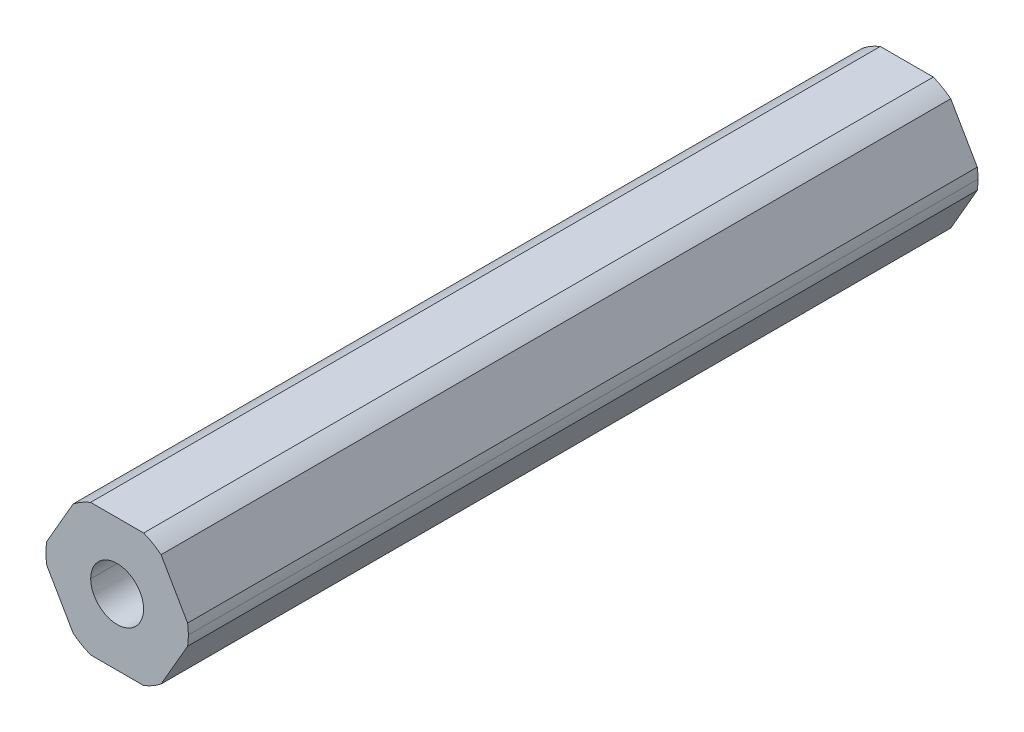
ISO-10303-21;
HEADER;
FILE_DESCRIPTION(('STEP AP214'),'2;1');
FILE_NAME('part.step','',(''),(''),'','','');
FILE_SCHEMA(('AUTOMOTIVE_DESIGN { 1 0 10303 214 1 1 1 1 }'));
ENDSEC;
DATA;
#1=APPLICATION_CONTEXT('core data for automotive mechanical design processes');
#2=APPLICATION_PROTOCOL_DEFINITION('international standard','automotive_design',2000,#1);
#3=PRODUCT_CONTEXT('',#1,'mechanical');
#4=PRODUCT('Part','Part','',(#3));
#5=PRODUCT_RELATED_PRODUCT_CATEGORY('part','',(#4));
#6=PRODUCT_DEFINITION_FORMATION('','',#4);
#7=PRODUCT_DEFINITION_CONTEXT('part definition',#1,'design');
#8=PRODUCT_DEFINITION('design','',#6,#7);
#9=PRODUCT_DEFINITION_SHAPE('','',#8);
#10=(LENGTH_UNIT() NAMED_UNIT(*) SI_UNIT(.MILLI.,.METRE.));
#11=(NAMED_UNIT(*) PLANE_ANGLE_UNIT() SI_UNIT($,.RADIAN.));
#12=(NAMED_UNIT(*) SI_UNIT($,.STERADIAN.) SOLID_ANGLE_UNIT());
#13=UNCERTAINTY_MEASURE_WITH_UNIT(LENGTH_MEASURE(1.E-05),#10,'distance_accuracy_value','');
#14=(GEOMETRIC_REPRESENTATION_CONTEXT(3) GLOBAL_UNCERTAINTY_ASSIGNED_CONTEXT((#13)) GLOBAL_UNIT_ASSIGNED_CONTEXT((#10,
#11,#12)) REPRESENTATION_CONTEXT('',''));
#15=CARTESIAN_POINT('',(0.,0.,0.));
#16=DIRECTION('',(0.,0.,1.));
#17=DIRECTION('',(1.,0.,0.));
#18=AXIS2_PLACEMENT_3D('',#15,#16,#17);
#19=CARTESIAN_POINT('',(0.,0.,-228.6));
#20=DIRECTION('',(0.,0.,1.));
#21=DIRECTION('',(1.,0.,0.));
#22=AXIS2_PLACEMENT_3D('',#19,#20,#21);
#23=CYLINDRICAL_SURFACE('',#22,2.55);
#24=CARTESIAN_POINT('',(0.,0.,152.4));
#25=DIRECTION('',(0.,0.,-1.));
#26=DIRECTION('',(-1.,0.,0.));
#27=AXIS2_PLACEMENT_3D('',#24,#25,#26);
#28=CIRCLE('',#27,2.55);
#29=CARTESIAN_POINT('',(2.55,0.,152.4));
#30=VERTEX_POINT('',#29);
#31=CARTESIAN_POINT('',(-2.55,0.,152.4));
#32=VERTEX_POINT('',#31);
#33=EDGE_CURVE('E59',#30,#32,#28,.F.);
#34=ORIENTED_EDGE('',*,*,#33,.F.);
#35=DIRECTION('',(0.,0.,1.));
#36=VECTOR('',#35,1.);
#37=CARTESIAN_POINT('',(2.55,0.,-228.6));
#38=LINE('',#37,#36);
#39=CARTESIAN_POINT('',(2.55,0.,228.6));
#40=VERTEX_POINT('',#39);
#41=EDGE_CURVE('E162',#30,#40,#38,.T.);
#42=ORIENTED_EDGE('',*,*,#41,.T.);
#43=CARTESIAN_POINT('',(0.,0.,228.6));
#44=DIRECTION('',(0.,0.,1.));
#45=DIRECTION('',(1.,0.,0.));
#46=AXIS2_PLACEMENT_3D('',#43,#44,#45);
#47=CIRCLE('',#46,2.55);
#48=CARTESIAN_POINT('',(-2.55,0.,228.6));
#49=VERTEX_POINT('',#48);
#50=EDGE_CURVE('E46',#40,#49,#47,.T.);
#51=ORIENTED_EDGE('',*,*,#50,.T.);
#52=DIRECTION('',(0.,0.,1.));
#53=VECTOR('',#52,1.);
#54=CARTESIAN_POINT('',(-2.55,0.,-228.6));
#55=LINE('',#54,#53);
#56=EDGE_CURVE('E164',#32,#49,#55,.T.);
#57=ORIENTED_EDGE('',*,*,#56,.F.);
#58=EDGE_LOOP('',(#34,#42,#51,#57));
#59=FACE_BOUND('',#58,.T.);
#60=ADVANCED_FACE('F38',(#59),#23,.F.);
#61=CARTESIAN_POINT('',(0.,0.,-228.6));
#62=DIRECTION('',(0.,0.,1.));
#63=DIRECTION('',(1.,0.,0.));
#64=AXIS2_PLACEMENT_3D('',#61,#62,#63);
#65=CYLINDRICAL_SURFACE('',#64,6.87);
#66=DIRECTION('',(0.,0.,-1.));
#67=VECTOR('',#66,1.);
#68=CARTESIAN_POINT('',(4.24149521323254,5.40431479062105,-228.6));
#69=LINE('',#68,#67);
#70=CARTESIAN_POINT('',(4.24149521323254,5.40431479062105,228.6));
#71=VERTEX_POINT('',#70);
#72=CARTESIAN_POINT('',(4.24149521323254,5.40431479062105,152.4));
#73=VERTEX_POINT('',#72);
#74=EDGE_CURVE('E252',#71,#73,#69,.T.);
#75=ORIENTED_EDGE('',*,*,#74,.T.);
#76=CARTESIAN_POINT('',(0.,0.,152.4));
#77=DIRECTION('',(0.,0.,-1.));
#78=DIRECTION('',(-1.,0.,0.));
#79=AXIS2_PLACEMENT_3D('',#76,#77,#78);
#80=CIRCLE('',#79,6.87);
#81=CARTESIAN_POINT('',(2.55952629210953,6.3754,152.4));
#82=VERTEX_POINT('',#81);
#83=EDGE_CURVE('E264',#73,#82,#80,.F.);
#84=ORIENTED_EDGE('',*,*,#83,.T.);
#85=DIRECTION('',(0.,0.,1.));
#86=VECTOR('',#85,1.);
#87=CARTESIAN_POINT('',(2.55952629210952,6.3754,-228.6));
#88=LINE('',#87,#86);
#89=CARTESIAN_POINT('',(2.55952629210952,6.3754,228.6));
#90=VERTEX_POINT('',#89);
#91=EDGE_CURVE('E198',#82,#90,#88,.T.);
#92=ORIENTED_EDGE('',*,*,#91,.T.);
#93=CARTESIAN_POINT('',(0.,0.,228.6));
#94=DIRECTION('',(0.,0.,1.));
#95=DIRECTION('',(1.,0.,0.));
#96=AXIS2_PLACEMENT_3D('',#93,#94,#95);
#97=CIRCLE('',#96,6.87);
#98=EDGE_CURVE('E219',#71,#90,#97,.T.);
#99=ORIENTED_EDGE('',*,*,#98,.F.);
#100=EDGE_LOOP('',(#75,#84,#92,#99));
#101=FACE_BOUND('',#100,.T.);
#102=ADVANCED_FACE('F263',(#101),#65,.T.);
#103=CARTESIAN_POINT('',(0.,0.,-228.6));
#104=DIRECTION('',(0.,0.,1.));
#105=DIRECTION('',(1.,0.,0.));
#106=AXIS2_PLACEMENT_3D('',#103,#104,#105);
#107=CYLINDRICAL_SURFACE('',#106,6.87);
#108=DIRECTION('',(0.,0.,-1.));
#109=VECTOR('',#108,1.);
#110=CARTESIAN_POINT('',(-2.55952629210953,6.3754,-228.6));
#111=LINE('',#110,#109);
#112=CARTESIAN_POINT('',(-2.55952629210953,6.3754,228.6));
#113=VERTEX_POINT('',#112);
#114=CARTESIAN_POINT('',(-2.55952629210953,6.3754,152.4));
#115=VERTEX_POINT('',#114);
#116=EDGE_CURVE('E193',#113,#115,#111,.T.);
#117=ORIENTED_EDGE('',*,*,#116,.T.);
#118=CARTESIAN_POINT('',(0.,0.,152.4));
#119=DIRECTION('',(0.,0.,-1.));
#120=DIRECTION('',(-1.,0.,0.));
#121=AXIS2_PLACEMENT_3D('',#118,#119,#120);
#122=CIRCLE('',#121,6.87);
#123=CARTESIAN_POINT('',(-4.24149521323255,5.40431479062105,152.4));
#124=VERTEX_POINT('',#123);
#125=EDGE_CURVE('E278',#115,#124,#122,.F.);
#126=ORIENTED_EDGE('',*,*,#125,.T.);
#127=DIRECTION('',(0.,0.,1.));
#128=VECTOR('',#127,1.);
#129=CARTESIAN_POINT('',(-4.24149521323255,5.40431479062105,-228.6));
#130=LINE('',#129,#128);
#131=CARTESIAN_POINT('',(-4.24149521323255,5.40431479062105,228.6));
#132=VERTEX_POINT('',#131);
#133=EDGE_CURVE('E233',#124,#132,#130,.T.);
#134=ORIENTED_EDGE('',*,*,#133,.T.);
#135=CARTESIAN_POINT('',(0.,0.,228.6));
#136=DIRECTION('',(0.,0.,1.));
#137=DIRECTION('',(1.,0.,0.));
#138=AXIS2_PLACEMENT_3D('',#135,#136,#137);
#139=CIRCLE('',#138,6.87);
#140=EDGE_CURVE('E202',#113,#132,#139,.T.);
#141=ORIENTED_EDGE('',*,*,#140,.F.);
#142=EDGE_LOOP('',(#117,#126,#134,#141));
#143=FACE_BOUND('',#142,.T.);
#144=ADVANCED_FACE('F277',(#143),#107,.T.);
#145=CARTESIAN_POINT('',(0.,0.,-228.6));
#146=DIRECTION('',(0.,0.,1.));
#147=DIRECTION('',(1.,0.,0.));
#148=AXIS2_PLACEMENT_3D('',#145,#146,#147);
#149=CYLINDRICAL_SURFACE('',#148,6.87);
#150=DIRECTION('',(0.,0.,-1.));
#151=VECTOR('',#150,1.);
#152=CARTESIAN_POINT('',(-6.80102150534208,0.97108520937896,-228.6));
#153=LINE('',#152,#151);
#154=CARTESIAN_POINT('',(-6.80102150534208,0.97108520937896,228.6));
#155=VERTEX_POINT('',#154);
#156=CARTESIAN_POINT('',(-6.80102150534208,0.97108520937896,152.4));
#157=VERTEX_POINT('',#156);
#158=EDGE_CURVE('E228',#155,#157,#153,.T.);
#159=ORIENTED_EDGE('',*,*,#158,.T.);
#160=CARTESIAN_POINT('',(0.,0.,152.4));
#161=DIRECTION('',(0.,0.,-1.));
#162=DIRECTION('',(-1.,0.,0.));
#163=AXIS2_PLACEMENT_3D('',#160,#161,#162);
#164=CIRCLE('',#163,6.87);
#165=CARTESIAN_POINT('',(-6.80102150534207,-0.971085209378956,152.4));
#166=VERTEX_POINT('',#165);
#167=EDGE_CURVE('E288',#157,#166,#164,.F.);
#168=ORIENTED_EDGE('',*,*,#167,.T.);
#169=DIRECTION('',(0.,0.,1.));
#170=VECTOR('',#169,1.);
#171=CARTESIAN_POINT('',(-6.80102150534208,-0.971085209378962,-228.6));
#172=LINE('',#171,#170);
#173=CARTESIAN_POINT('',(-6.80102150534208,-0.971085209378956,228.6));
#174=VERTEX_POINT('',#173);
#175=EDGE_CURVE('E186',#166,#174,#172,.T.);
#176=ORIENTED_EDGE('',*,*,#175,.T.);
#177=CARTESIAN_POINT('',(0.,0.,228.6));
#178=DIRECTION('',(0.,0.,1.));
#179=DIRECTION('',(1.,0.,0.));
#180=AXIS2_PLACEMENT_3D('',#177,#178,#179);
#181=CIRCLE('',#180,6.87);
#182=EDGE_CURVE('E191',#155,#174,#181,.T.);
#183=ORIENTED_EDGE('',*,*,#182,.F.);
#184=EDGE_LOOP('',(#159,#168,#176,#183));
#185=FACE_BOUND('',#184,.T.);
#186=ADVANCED_FACE('F287',(#185),#149,.T.);
#187=CARTESIAN_POINT('',(0.,0.,-228.6));
#188=DIRECTION('',(0.,0.,1.));
#189=DIRECTION('',(1.,0.,0.));
#190=AXIS2_PLACEMENT_3D('',#187,#188,#189);
#191=CYLINDRICAL_SURFACE('',#190,6.87);
#192=DIRECTION('',(0.,0.,-1.));
#193=VECTOR('',#192,1.);
#194=CARTESIAN_POINT('',(-4.24149521323255,-5.40431479062104,-228.6));
#195=LINE('',#194,#193);
#196=CARTESIAN_POINT('',(-4.24149521323254,-5.40431479062105,228.6));
#197=VERTEX_POINT('',#196);
#198=CARTESIAN_POINT('',(-4.24149521323254,-5.40431479062105,152.4));
#199=VERTEX_POINT('',#198);
#200=EDGE_CURVE('E181',#197,#199,#195,.T.);
#201=ORIENTED_EDGE('',*,*,#200,.T.);
#202=CARTESIAN_POINT('',(0.,0.,152.4));
#203=DIRECTION('',(0.,0.,-1.));
#204=DIRECTION('',(-1.,0.,0.));
#205=AXIS2_PLACEMENT_3D('',#202,#203,#204);
#206=CIRCLE('',#205,6.87);
#207=CARTESIAN_POINT('',(-2.55952629210953,-6.3754,152.4));
#208=VERTEX_POINT('',#207);
#209=EDGE_CURVE('E298',#199,#208,#206,.F.);
#210=ORIENTED_EDGE('',*,*,#209,.T.);
#211=DIRECTION('',(0.,0.,1.));
#212=VECTOR('',#211,1.);
#213=CARTESIAN_POINT('',(-2.55952629210953,-6.3754,-228.6));
#214=LINE('',#213,#212);
#215=CARTESIAN_POINT('',(-2.55952629210953,-6.3754,228.6));
#216=VERTEX_POINT('',#215);
#217=EDGE_CURVE('E208',#208,#216,#214,.T.);
#218=ORIENTED_EDGE('',*,*,#217,.T.);
#219=CARTESIAN_POINT('',(0.,0.,228.6));
#220=DIRECTION('',(0.,0.,1.));
#221=DIRECTION('',(1.,0.,0.));
#222=AXIS2_PLACEMENT_3D('',#219,#220,#221);
#223=CIRCLE('',#222,6.87);
#224=EDGE_CURVE('E187',#197,#216,#223,.T.);
#225=ORIENTED_EDGE('',*,*,#224,.F.);
#226=EDGE_LOOP('',(#201,#210,#218,#225));
#227=FACE_BOUND('',#226,.T.);
#228=ADVANCED_FACE('F40',(#227),#191,.T.);
#229=CARTESIAN_POINT('',(0.,0.,-228.6));
#230=DIRECTION('',(0.,0.,1.));
#231=DIRECTION('',(1.,0.,0.));
#232=AXIS2_PLACEMENT_3D('',#229,#230,#231);
#233=CYLINDRICAL_SURFACE('',#232,6.87);
#234=DIRECTION('',(0.,0.,-1.));
#235=VECTOR('',#234,1.);
#236=CARTESIAN_POINT('',(2.55952629210953,-6.3754,-228.6));
#237=LINE('',#236,#235);
#238=CARTESIAN_POINT('',(2.55952629210953,-6.3754,228.6));
#239=VERTEX_POINT('',#238);
#240=CARTESIAN_POINT('',(2.55952629210953,-6.3754,152.4));
#241=VERTEX_POINT('',#240);
#242=EDGE_CURVE('E203',#239,#241,#237,.T.);
#243=ORIENTED_EDGE('',*,*,#242,.T.);
#244=CARTESIAN_POINT('',(0.,0.,152.4));
#245=DIRECTION('',(0.,0.,-1.));
#246=DIRECTION('',(-1.,0.,0.));
#247=AXIS2_PLACEMENT_3D('',#244,#245,#246);
#248=CIRCLE('',#247,6.87);
#249=CARTESIAN_POINT('',(4.24149521323254,-5.40431479062105,152.4));
#250=VERTEX_POINT('',#249);
#251=EDGE_CURVE('E309',#241,#250,#248,.F.);
#252=ORIENTED_EDGE('',*,*,#251,.T.);
#253=DIRECTION('',(0.,0.,1.));
#254=VECTOR('',#253,1.);
#255=CARTESIAN_POINT('',(4.24149521323255,-5.40431479062104,-228.6));
#256=LINE('',#255,#254);
#257=CARTESIAN_POINT('',(4.24149521323254,-5.40431479062105,228.6));
#258=VERTEX_POINT('',#257);
#259=EDGE_CURVE('E222',#250,#258,#256,.T.);
#260=ORIENTED_EDGE('',*,*,#259,.T.);
#261=CARTESIAN_POINT('',(0.,0.,228.6));
#262=DIRECTION('',(0.,0.,1.));
#263=DIRECTION('',(1.,0.,0.));
#264=AXIS2_PLACEMENT_3D('',#261,#262,#263);
#265=CIRCLE('',#264,6.87);
#266=EDGE_CURVE('E190',#239,#258,#265,.T.);
#267=ORIENTED_EDGE('',*,*,#266,.F.);
#268=EDGE_LOOP('',(#243,#252,#260,#267));
#269=FACE_BOUND('',#268,.T.);
#270=ADVANCED_FACE('F308',(#269),#233,.T.);
#271=CARTESIAN_POINT('',(0.,0.,-228.6));
#272=DIRECTION('',(0.,0.,1.));
#273=DIRECTION('',(1.,0.,0.));
#274=AXIS2_PLACEMENT_3D('',#271,#272,#273);
#275=CYLINDRICAL_SURFACE('',#274,6.87);
#276=DIRECTION('',(0.,0.,1.));
#277=VECTOR('',#276,1.);
#278=CARTESIAN_POINT('',(6.87,0.,-228.6));
#279=LINE('',#278,#277);
#280=CARTESIAN_POINT('',(6.87,0.,152.4));
#281=VERTEX_POINT('',#280);
#282=CARTESIAN_POINT('',(6.87,0.,228.6));
#283=VERTEX_POINT('',#282);
#284=EDGE_CURVE('E171',#281,#283,#279,.T.);
#285=ORIENTED_EDGE('',*,*,#284,.F.);
#286=CARTESIAN_POINT('',(0.,0.,152.4));
#287=DIRECTION('',(0.,0.,-1.));
#288=DIRECTION('',(-1.,0.,0.));
#289=AXIS2_PLACEMENT_3D('',#286,#287,#288);
#290=CIRCLE('',#289,6.87);
#291=CARTESIAN_POINT('',(6.80102150534208,0.97108520937895,152.4));
#292=VERTEX_POINT('',#291);
#293=EDGE_CURVE('E53',#281,#292,#290,.F.);
#294=ORIENTED_EDGE('',*,*,#293,.T.);
#295=DIRECTION('',(0.,0.,1.));
#296=VECTOR('',#295,1.);
#297=CARTESIAN_POINT('',(6.80102150534208,0.971085209378949,-228.6));
#298=LINE('',#297,#296);
#299=CARTESIAN_POINT('',(6.80102150534208,0.97108520937895,228.6));
#300=VERTEX_POINT('',#299);
#301=EDGE_CURVE('E236',#292,#300,#298,.T.);
#302=ORIENTED_EDGE('',*,*,#301,.T.);
#303=CARTESIAN_POINT('',(0.,0.,228.6));
#304=DIRECTION('',(0.,0.,1.));
#305=DIRECTION('',(1.,0.,0.));
#306=AXIS2_PLACEMENT_3D('',#303,#304,#305);
#307=CIRCLE('',#306,6.87);
#308=EDGE_CURVE('E209',#283,#300,#307,.T.);
#309=ORIENTED_EDGE('',*,*,#308,.F.);
#310=EDGE_LOOP('',(#285,#294,#302,#309));
#311=FACE_BOUND('',#310,.T.);
#312=ADVANCED_FACE('F349',(#311),#275,.T.);
#313=CARTESIAN_POINT('',(-3.68083890619154,-6.3754,228.6));
#314=DIRECTION('',(0.,1.,0.));
#315=DIRECTION('',(1.,0.,0.));
#316=AXIS2_PLACEMENT_3D('',#313,#314,#315);
#317=PLANE('',#316);
#318=DIRECTION('',(-1.,0.,0.));
#319=VECTOR('',#318,1.);
#320=CARTESIAN_POINT('',(-3.68083890619154,-6.3754,152.4));
#321=LINE('',#320,#319);
#322=EDGE_CURVE('E305',#241,#208,#321,.T.);
#323=ORIENTED_EDGE('',*,*,#322,.F.);
#324=ORIENTED_EDGE('',*,*,#242,.F.);
#325=DIRECTION('',(1.,0.,0.));
#326=VECTOR('',#325,1.);
#327=CARTESIAN_POINT('',(-3.68083890619154,-6.3754,228.6));
#328=LINE('',#327,#326);
#329=EDGE_CURVE('E207',#216,#239,#328,.T.);
#330=ORIENTED_EDGE('',*,*,#329,.F.);
#331=ORIENTED_EDGE('',*,*,#217,.F.);
#332=EDGE_LOOP('',(#323,#324,#330,#331));
#333=FACE_BOUND('',#332,.T.);
#334=ADVANCED_FACE('F304',(#333),#317,.F.);
#335=CARTESIAN_POINT('',(-7.36167781238308,0.,228.6));
#336=DIRECTION('',(0.866025403784439,0.5,0.));
#337=DIRECTION('',(0.,0.,-1.));
#338=AXIS2_PLACEMENT_3D('',#335,#336,#337);
#339=PLANE('',#338);
#340=DIRECTION('',(-0.5,0.866025403784439,0.));
#341=VECTOR('',#340,1.);
#342=CARTESIAN_POINT('',(-7.36167781238308,0.,152.4));
#343=LINE('',#342,#341);
#344=EDGE_CURVE('E295',#199,#166,#343,.T.);
#345=ORIENTED_EDGE('',*,*,#344,.F.);
#346=ORIENTED_EDGE('',*,*,#200,.F.);
#347=DIRECTION('',(0.5,-0.866025403784439,0.));
#348=VECTOR('',#347,1.);
#349=CARTESIAN_POINT('',(-7.36167781238308,0.,228.6));
#350=LINE('',#349,#348);
#351=EDGE_CURVE('E185',#174,#197,#350,.T.);
#352=ORIENTED_EDGE('',*,*,#351,.F.);
#353=ORIENTED_EDGE('',*,*,#175,.F.);
#354=EDGE_LOOP('',(#345,#346,#352,#353));
#355=FACE_BOUND('',#354,.T.);
#356=ADVANCED_FACE('F294',(#355),#339,.F.);
#357=CARTESIAN_POINT('',(-3.68083890619154,6.3754,228.6));
#358=DIRECTION('',(0.866025403784439,-0.5,0.));
#359=DIRECTION('',(0.,0.,-1.));
#360=AXIS2_PLACEMENT_3D('',#357,#358,#359);
#361=PLANE('',#360);
#362=DIRECTION('',(0.5,0.866025403784439,0.));
#363=VECTOR('',#362,1.);
#364=CARTESIAN_POINT('',(-3.68083890619154,6.3754,152.4));
#365=LINE('',#364,#363);
#366=EDGE_CURVE('E214',#157,#124,#365,.T.);
#367=ORIENTED_EDGE('',*,*,#366,.F.);
#368=ORIENTED_EDGE('',*,*,#158,.F.);
#369=DIRECTION('',(-0.5,-0.866025403784439,0.));
#370=VECTOR('',#369,1.);
#371=CARTESIAN_POINT('',(-3.68083890619154,6.3754,228.6));
#372=LINE('',#371,#370);
#373=EDGE_CURVE('E232',#132,#155,#372,.T.);
#374=ORIENTED_EDGE('',*,*,#373,.F.);
#375=ORIENTED_EDGE('',*,*,#133,.F.);
#376=EDGE_LOOP('',(#367,#368,#374,#375));
#377=FACE_BOUND('',#376,.T.);
#378=ADVANCED_FACE('F284',(#377),#361,.F.);
#379=CARTESIAN_POINT('',(3.68083890619154,6.3754,228.6));
#380=DIRECTION('',(0.,-1.,0.));
#381=DIRECTION('',(0.,0.,-1.));
#382=AXIS2_PLACEMENT_3D('',#379,#380,#381);
#383=PLANE('',#382);
#384=DIRECTION('',(1.,0.,0.));
#385=VECTOR('',#384,1.);
#386=CARTESIAN_POINT('',(3.68083890619154,6.3754,152.4));
#387=LINE('',#386,#385);
#388=EDGE_CURVE('E274',#115,#82,#387,.T.);
#389=ORIENTED_EDGE('',*,*,#388,.F.);
#390=ORIENTED_EDGE('',*,*,#116,.F.);
#391=DIRECTION('',(-1.,0.,0.));
#392=VECTOR('',#391,1.);
#393=CARTESIAN_POINT('',(3.68083890619154,6.3754,228.6));
#394=LINE('',#393,#392);
#395=EDGE_CURVE('E197',#90,#113,#394,.T.);
#396=ORIENTED_EDGE('',*,*,#395,.F.);
#397=ORIENTED_EDGE('',*,*,#91,.F.);
#398=EDGE_LOOP('',(#389,#390,#396,#397));
#399=FACE_BOUND('',#398,.T.);
#400=ADVANCED_FACE('F273',(#399),#383,.F.);
#401=CARTESIAN_POINT('',(7.36167781238308,0.,228.6));
#402=DIRECTION('',(-0.866025403784439,-0.5,0.));
#403=DIRECTION('',(-0.5,0.866025403784439,0.));
#404=AXIS2_PLACEMENT_3D('',#401,#402,#403);
#405=PLANE('',#404);
#406=DIRECTION('',(0.5,-0.866025403784439,0.));
#407=VECTOR('',#406,1.);
#408=CARTESIAN_POINT('',(7.36167781238308,0.,152.4));
#409=LINE('',#408,#407);
#410=EDGE_CURVE('E336',#73,#292,#409,.T.);
#411=ORIENTED_EDGE('',*,*,#410,.F.);
#412=ORIENTED_EDGE('',*,*,#74,.F.);
#413=DIRECTION('',(-0.5,0.866025403784439,0.));
#414=VECTOR('',#413,1.);
#415=CARTESIAN_POINT('',(7.36167781238308,0.,228.6));
#416=LINE('',#415,#414);
#417=EDGE_CURVE('E256',#300,#71,#416,.T.);
#418=ORIENTED_EDGE('',*,*,#417,.F.);
#419=ORIENTED_EDGE('',*,*,#301,.F.);
#420=EDGE_LOOP('',(#411,#412,#418,#419));
#421=FACE_BOUND('',#420,.T.);
#422=ADVANCED_FACE('F334',(#421),#405,.F.);
#423=CARTESIAN_POINT('',(3.68083890619154,-6.3754,228.6));
#424=DIRECTION('',(-0.866025403784439,0.5,0.));
#425=DIRECTION('',(0.,0.,1.));
#426=AXIS2_PLACEMENT_3D('',#423,#424,#425);
#427=PLANE('',#426);
#428=DIRECTION('',(-0.5,-0.866025403784439,0.));
#429=VECTOR('',#428,1.);
#430=CARTESIAN_POINT('',(3.68083890619154,-6.3754,152.4));
#431=LINE('',#430,#429);
#432=CARTESIAN_POINT('',(6.80102150534208,-0.971085209378955,152.4));
#433=VERTEX_POINT('',#432);
#434=EDGE_CURVE('E319',#433,#250,#431,.T.);
#435=ORIENTED_EDGE('',*,*,#434,.F.);
#436=DIRECTION('',(0.,0.,-1.));
#437=VECTOR('',#436,1.);
#438=CARTESIAN_POINT('',(6.80102150534208,-0.971085209378962,-228.6));
#439=LINE('',#438,#437);
#440=CARTESIAN_POINT('',(6.80102150534208,-0.971085209378955,228.6));
#441=VERTEX_POINT('',#440);
#442=EDGE_CURVE('E179',#441,#433,#439,.T.);
#443=ORIENTED_EDGE('',*,*,#442,.F.);
#444=DIRECTION('',(0.5,0.866025403784439,0.));
#445=VECTOR('',#444,1.);
#446=CARTESIAN_POINT('',(3.68083890619154,-6.3754,228.6));
#447=LINE('',#446,#445);
#448=EDGE_CURVE('E224',#258,#441,#447,.T.);
#449=ORIENTED_EDGE('',*,*,#448,.F.);
#450=ORIENTED_EDGE('',*,*,#259,.F.);
#451=EDGE_LOOP('',(#435,#443,#449,#450));
#452=FACE_BOUND('',#451,.T.);
#453=ADVANCED_FACE('F316',(#452),#427,.F.);
#454=CARTESIAN_POINT('',(0.,0.,-228.6));
#455=DIRECTION('',(0.,0.,1.));
#456=DIRECTION('',(1.,0.,0.));
#457=AXIS2_PLACEMENT_3D('',#454,#455,#456);
#458=CYLINDRICAL_SURFACE('',#457,6.87);
#459=ORIENTED_EDGE('',*,*,#442,.T.);
#460=CARTESIAN_POINT('',(0.,0.,152.4));
#461=DIRECTION('',(0.,0.,-1.));
#462=DIRECTION('',(-1.,0.,0.));
#463=AXIS2_PLACEMENT_3D('',#460,#461,#462);
#464=CIRCLE('',#463,6.87);
#465=EDGE_CURVE('E165',#433,#281,#464,.F.);
#466=ORIENTED_EDGE('',*,*,#465,.T.);
#467=ORIENTED_EDGE('',*,*,#284,.T.);
#468=CARTESIAN_POINT('',(0.,0.,228.6));
#469=DIRECTION('',(0.,0.,1.));
#470=DIRECTION('',(1.,0.,0.));
#471=AXIS2_PLACEMENT_3D('',#468,#469,#470);
#472=CIRCLE('',#471,6.87);
#473=EDGE_CURVE('E173',#441,#283,#472,.T.);
#474=ORIENTED_EDGE('',*,*,#473,.F.);
#475=EDGE_LOOP('',(#459,#466,#467,#474));
#476=FACE_BOUND('',#475,.T.);
#477=ADVANCED_FACE('F322',(#476),#458,.T.);
#478=CARTESIAN_POINT('',(0.,0.,-228.6));
#479=DIRECTION('',(0.,0.,1.));
#480=DIRECTION('',(1.,0.,0.));
#481=AXIS2_PLACEMENT_3D('',#478,#479,#480);
#482=CYLINDRICAL_SURFACE('',#481,2.55);
#483=CARTESIAN_POINT('',(0.,0.,152.4));
#484=DIRECTION('',(0.,0.,-1.));
#485=DIRECTION('',(-1.,0.,0.));
#486=AXIS2_PLACEMENT_3D('',#483,#484,#485);
#487=CIRCLE('',#486,2.55);
#488=EDGE_CURVE('E11',#32,#30,#487,.F.);
#489=ORIENTED_EDGE('',*,*,#488,.F.);
#490=ORIENTED_EDGE('',*,*,#56,.T.);
#491=CARTESIAN_POINT('',(0.,0.,228.6));
#492=DIRECTION('',(0.,0.,1.));
#493=DIRECTION('',(1.,0.,0.));
#494=AXIS2_PLACEMENT_3D('',#491,#492,#493);
#495=CIRCLE('',#494,2.55);
#496=EDGE_CURVE('E170',#49,#40,#495,.T.);
#497=ORIENTED_EDGE('',*,*,#496,.T.);
#498=ORIENTED_EDGE('',*,*,#41,.F.);
#499=EDGE_LOOP('',(#489,#490,#497,#498));
#500=FACE_BOUND('',#499,.T.);
#501=ADVANCED_FACE('F168',(#500),#482,.F.);
#502=CARTESIAN_POINT('',(0.,0.,228.6));
#503=DIRECTION('',(0.,0.,1.));
#504=DIRECTION('',(1.,0.,0.));
#505=AXIS2_PLACEMENT_3D('',#502,#503,#504);
#506=PLANE('',#505);
#507=ORIENTED_EDGE('',*,*,#50,.F.);
#508=ORIENTED_EDGE('',*,*,#496,.F.);
#509=EDGE_LOOP('',(#507,#508));
#510=FACE_BOUND('',#509,.T.);
#511=ORIENTED_EDGE('',*,*,#417,.T.);
#512=ORIENTED_EDGE('',*,*,#98,.T.);
#513=ORIENTED_EDGE('',*,*,#395,.T.);
#514=ORIENTED_EDGE('',*,*,#140,.T.);
#515=ORIENTED_EDGE('',*,*,#373,.T.);
#516=ORIENTED_EDGE('',*,*,#182,.T.);
#517=ORIENTED_EDGE('',*,*,#351,.T.);
#518=ORIENTED_EDGE('',*,*,#224,.T.);
#519=ORIENTED_EDGE('',*,*,#329,.T.);
#520=ORIENTED_EDGE('',*,*,#266,.T.);
#521=ORIENTED_EDGE('',*,*,#448,.T.);
#522=ORIENTED_EDGE('',*,*,#473,.T.);
#523=ORIENTED_EDGE('',*,*,#308,.T.);
#524=EDGE_LOOP('',(#511,#512,#513,#514,#515,#516,#517,#518,#519,#520,#521,#522,#523));
#525=FACE_BOUND('',#524,.T.);
#526=ADVANCED_FACE('F269',(#510,#525),#506,.T.);
#527=CARTESIAN_POINT('',(0.,0.,152.4));
#528=DIRECTION('',(0.,0.,-1.));
#529=DIRECTION('',(-1.,0.,0.));
#530=AXIS2_PLACEMENT_3D('',#527,#528,#529);
#531=PLANE('',#530);
#532=ORIENTED_EDGE('',*,*,#33,.T.);
#533=ORIENTED_EDGE('',*,*,#488,.T.);
#534=EDGE_LOOP('',(#532,#533));
#535=FACE_BOUND('',#534,.T.);
#536=ORIENTED_EDGE('',*,*,#366,.T.);
#537=ORIENTED_EDGE('',*,*,#125,.F.);
#538=ORIENTED_EDGE('',*,*,#388,.T.);
#539=ORIENTED_EDGE('',*,*,#83,.F.);
#540=ORIENTED_EDGE('',*,*,#410,.T.);
#541=ORIENTED_EDGE('',*,*,#293,.F.);
#542=ORIENTED_EDGE('',*,*,#465,.F.);
#543=ORIENTED_EDGE('',*,*,#434,.T.);
#544=ORIENTED_EDGE('',*,*,#251,.F.);
#545=ORIENTED_EDGE('',*,*,#322,.T.);
#546=ORIENTED_EDGE('',*,*,#209,.F.);
#547=ORIENTED_EDGE('',*,*,#344,.T.);
#548=ORIENTED_EDGE('',*,*,#167,.F.);
#549=EDGE_LOOP('',(#536,#537,#538,#539,#540,#541,#542,#543,#544,#545,#546,#547,#548));
#550=FACE_BOUND('',#549,.T.);
#551=ADVANCED_FACE('F156',(#535,#550),#531,.T.);
#552=CLOSED_SHELL('',(#60,#102,#144,#186,#228,#270,#312,#334,#356,#378,#400,#422,#453,#477,#501,
#526,#551));
#553=MANIFOLD_SOLID_BREP('B2',#552);
#554=ADVANCED_BREP_SHAPE_REPRESENTATION('',(#18,#553),#14);
#555=SHAPE_DEFINITION_REPRESENTATION(#9,#554);
ENDSEC;
END-ISO-10303-21;
